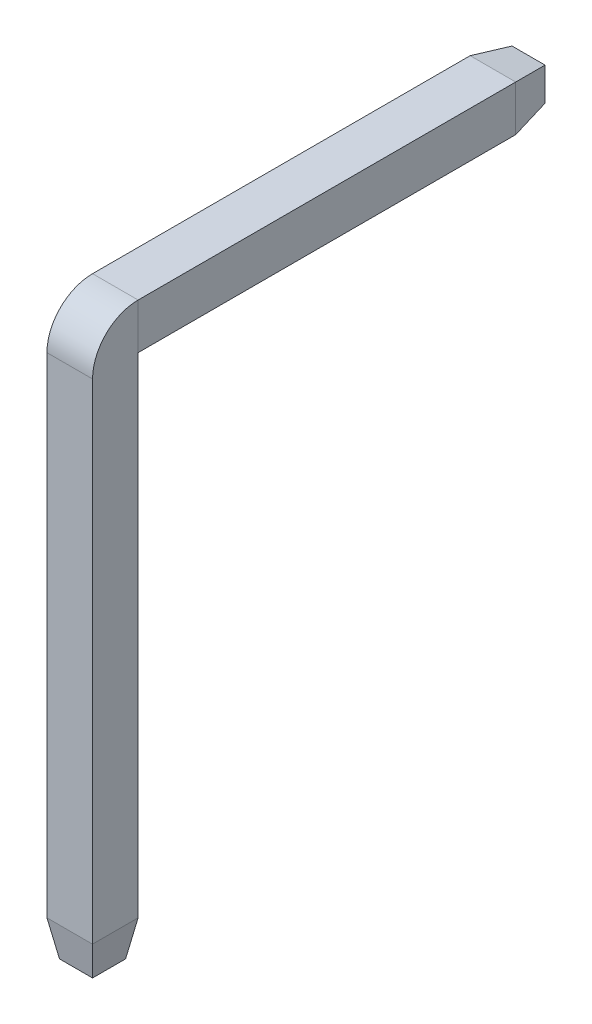
ISO-10303-21;
HEADER;
FILE_DESCRIPTION(('STEP AP214'),'2;1');
FILE_NAME('part.step','',(''),(''),'','','');
FILE_SCHEMA(('AUTOMOTIVE_DESIGN { 1 0 10303 214 1 1 1 1 }'));
ENDSEC;
DATA;
#1=APPLICATION_CONTEXT('core data for automotive mechanical design processes');
#2=APPLICATION_PROTOCOL_DEFINITION('international standard','automotive_design',2000,#1);
#3=PRODUCT_CONTEXT('',#1,'mechanical');
#4=PRODUCT('Part','Part','',(#3));
#5=PRODUCT_RELATED_PRODUCT_CATEGORY('part','',(#4));
#6=PRODUCT_DEFINITION_FORMATION('','',#4);
#7=PRODUCT_DEFINITION_CONTEXT('part definition',#1,'design');
#8=PRODUCT_DEFINITION('design','',#6,#7);
#9=PRODUCT_DEFINITION_SHAPE('','',#8);
#10=(LENGTH_UNIT() NAMED_UNIT(*) SI_UNIT(.MILLI.,.METRE.));
#11=(NAMED_UNIT(*) PLANE_ANGLE_UNIT() SI_UNIT($,.RADIAN.));
#12=(NAMED_UNIT(*) SI_UNIT($,.STERADIAN.) SOLID_ANGLE_UNIT());
#13=UNCERTAINTY_MEASURE_WITH_UNIT(LENGTH_MEASURE(1.E-05),#10,'distance_accuracy_value','');
#14=(GEOMETRIC_REPRESENTATION_CONTEXT(3) GLOBAL_UNCERTAINTY_ASSIGNED_CONTEXT((#13)) GLOBAL_UNIT_ASSIGNED_CONTEXT((#10,
#11,#12)) REPRESENTATION_CONTEXT('',''));
#15=CARTESIAN_POINT('',(0.,0.,0.));
#16=DIRECTION('',(0.,0.,1.));
#17=DIRECTION('',(1.,0.,0.));
#18=AXIS2_PLACEMENT_3D('',#15,#16,#17);
#19=CARTESIAN_POINT('',(-0.321,-2.50099999999999,0.320000000000001));
#20=DIRECTION('',(0.,0.,1.));
#21=DIRECTION('',(1.,0.,0.));
#22=AXIS2_PLACEMENT_3D('',#19,#20,#21);
#23=PLANE('',#22);
#24=DIRECTION('',(0.,-1.,0.));
#25=VECTOR('',#24,1.);
#26=CARTESIAN_POINT('',(0.32,1.255,0.320000000000001));
#27=LINE('',#26,#25);
#28=CARTESIAN_POINT('',(0.32,4.37,0.320000000000001));
#29=VERTEX_POINT('',#28);
#30=CARTESIAN_POINT('',(0.320000000000001,-2.49999999999999,0.320000000000001));
#31=VERTEX_POINT('',#30);
#32=EDGE_CURVE('P0_E103',#29,#31,#27,.T.);
#33=ORIENTED_EDGE('',*,*,#32,.F.);
#34=DIRECTION('',(-1.,0.,0.));
#35=VECTOR('',#34,1.);
#36=CARTESIAN_POINT('',(0.,4.37,0.320000000000001));
#37=LINE('',#36,#35);
#38=CARTESIAN_POINT('',(-0.32,4.37,0.320000000000001));
#39=VERTEX_POINT('',#38);
#40=EDGE_CURVE('P0_E71',#29,#39,#37,.T.);
#41=ORIENTED_EDGE('',*,*,#40,.T.);
#42=DIRECTION('',(0.,1.,0.));
#43=VECTOR('',#42,1.);
#44=CARTESIAN_POINT('',(-0.32,1.255,0.320000000000001));
#45=LINE('',#44,#43);
#46=CARTESIAN_POINT('',(-0.320000000000001,-2.49999999999998,0.320000000000002));
#47=VERTEX_POINT('',#46);
#48=EDGE_CURVE('P0_E83',#47,#39,#45,.T.);
#49=ORIENTED_EDGE('',*,*,#48,.F.);
#50=DIRECTION('',(-1.,0.,0.));
#51=VECTOR('',#50,1.);
#52=CARTESIAN_POINT('',(0.,-2.49999999999999,0.320000000000002));
#53=LINE('',#52,#51);
#54=EDGE_CURVE('P0_E61',#31,#47,#53,.T.);
#55=ORIENTED_EDGE('',*,*,#54,.F.);
#56=EDGE_LOOP('',(#33,#41,#49,#55));
#57=FACE_BOUND('',#56,.T.);
#58=ADVANCED_FACE('P0_F17',(#57),#23,.T.);
#59=CARTESIAN_POINT('',(0.321,-2.49901519224698,0.320173648177668));
#60=DIRECTION('',(0.,-0.17364817766693,0.984807753012208));
#61=DIRECTION('',(-1.,0.,0.));
#62=AXIS2_PLACEMENT_3D('',#59,#60,#61);
#63=PLANE('',#62);
#64=DIRECTION('',(-0.171087869746035,-0.970287525247814,-0.171087869746033));
#65=VECTOR('',#64,1.);
#66=CARTESIAN_POINT('',(0.320000000000001,-2.49999999999999,0.320000000000001));
#67=LINE('',#66,#65);
#68=CARTESIAN_POINT('',(0.231836509645767,-3.,0.231836509645768));
#69=VERTEX_POINT('',#68);
#70=EDGE_CURVE('P0_E21',#31,#69,#67,.T.);
#71=ORIENTED_EDGE('',*,*,#70,.F.);
#72=ORIENTED_EDGE('',*,*,#54,.T.);
#73=DIRECTION('',(-0.171087869746035,0.970287525247814,0.171087869746033));
#74=VECTOR('',#73,1.);
#75=CARTESIAN_POINT('',(-0.231836509645767,-3.,0.231836509645768));
#76=LINE('',#75,#74);
#77=CARTESIAN_POINT('',(-0.231836509645767,-3.,0.231836509645768));
#78=VERTEX_POINT('',#77);
#79=EDGE_CURVE('P0_E101',#78,#47,#76,.T.);
#80=ORIENTED_EDGE('',*,*,#79,.F.);
#81=DIRECTION('',(-1.,0.,0.));
#82=VECTOR('',#81,1.);
#83=CARTESIAN_POINT('',(0.,-3.,0.231836509645768));
#84=LINE('',#83,#82);
#85=EDGE_CURVE('P0_E111',#69,#78,#84,.T.);
#86=ORIENTED_EDGE('',*,*,#85,.F.);
#87=EDGE_LOOP('',(#71,#72,#80,#86));
#88=FACE_BOUND('',#87,.T.);
#89=ADVANCED_FACE('P0_F131',(#88),#63,.T.);
#90=CARTESIAN_POINT('',(0.32,-2.50099999999999,0.321000000000001));
#91=DIRECTION('',(1.,0.,0.));
#92=DIRECTION('',(0.,0.,-1.));
#93=AXIS2_PLACEMENT_3D('',#90,#91,#92);
#94=PLANE('',#93);
#95=ORIENTED_EDGE('',*,*,#32,.T.);
#96=DIRECTION('',(0.,0.,1.));
#97=VECTOR('',#96,1.);
#98=CARTESIAN_POINT('',(0.320000000000001,-2.49999999999999,0.));
#99=LINE('',#98,#97);
#100=CARTESIAN_POINT('',(0.32,-2.49999999999999,-0.320000000000001));
#101=VERTEX_POINT('',#100);
#102=EDGE_CURVE('P0_E106',#101,#31,#99,.T.);
#103=ORIENTED_EDGE('',*,*,#102,.F.);
#104=DIRECTION('',(0.,-1.,0.));
#105=VECTOR('',#104,1.);
#106=CARTESIAN_POINT('',(0.32,1.255,-0.32));
#107=LINE('',#106,#105);
#108=CARTESIAN_POINT('',(0.32,5.01,-0.32));
#109=VERTEX_POINT('',#108);
#110=EDGE_CURVE('P0_E78',#109,#101,#107,.T.);
#111=ORIENTED_EDGE('',*,*,#110,.F.);
#112=CARTESIAN_POINT('',(0.32,4.37,-0.32));
#113=DIRECTION('',(1.,0.,0.));
#114=DIRECTION('',(0.,0.,-1.));
#115=AXIS2_PLACEMENT_3D('',#112,#113,#114);
#116=CIRCLE('',#115,0.64);
#117=EDGE_CURVE('P0_E84',#29,#109,#116,.F.);
#118=ORIENTED_EDGE('',*,*,#117,.F.);
#119=EDGE_LOOP('',(#95,#103,#111,#118));
#120=FACE_BOUND('',#119,.T.);
#121=ADVANCED_FACE('P0_F138',(#120),#94,.T.);
#122=CARTESIAN_POINT('',(-0.32,-2.50099999999999,-0.321000000000001));
#123=DIRECTION('',(-1.,0.,0.));
#124=DIRECTION('',(0.,0.,1.));
#125=AXIS2_PLACEMENT_3D('',#122,#123,#124);
#126=PLANE('',#125);
#127=DIRECTION('',(0.,0.,-1.));
#128=VECTOR('',#127,1.);
#129=CARTESIAN_POINT('',(-0.320000000000001,-2.49999999999999,0.));
#130=LINE('',#129,#128);
#131=CARTESIAN_POINT('',(-0.320000000000001,-2.49999999999998,-0.320000000000001));
#132=VERTEX_POINT('',#131);
#133=EDGE_CURVE('P0_E100',#47,#132,#130,.T.);
#134=ORIENTED_EDGE('',*,*,#133,.F.);
#135=ORIENTED_EDGE('',*,*,#48,.T.);
#136=CARTESIAN_POINT('',(-0.32,4.37,-0.32));
#137=DIRECTION('',(-1.,0.,0.));
#138=DIRECTION('',(0.,0.,1.));
#139=AXIS2_PLACEMENT_3D('',#136,#137,#138);
#140=CIRCLE('',#139,0.64);
#141=CARTESIAN_POINT('',(-0.32,5.01,-0.32));
#142=VERTEX_POINT('',#141);
#143=EDGE_CURVE('P0_E80',#142,#39,#140,.F.);
#144=ORIENTED_EDGE('',*,*,#143,.F.);
#145=DIRECTION('',(0.,1.,0.));
#146=VECTOR('',#145,1.);
#147=CARTESIAN_POINT('',(-0.32,1.255,-0.32));
#148=LINE('',#147,#146);
#149=EDGE_CURVE('P0_E36',#132,#142,#148,.T.);
#150=ORIENTED_EDGE('',*,*,#149,.F.);
#151=EDGE_LOOP('',(#134,#135,#144,#150));
#152=FACE_BOUND('',#151,.T.);
#153=ADVANCED_FACE('P0_F82',(#152),#126,.T.);
#154=CARTESIAN_POINT('',(-0.32,4.37,-0.32));
#155=DIRECTION('',(1.,0.,0.));
#156=DIRECTION('',(0.,0.,-1.));
#157=AXIS2_PLACEMENT_3D('',#154,#155,#156);
#158=CYLINDRICAL_SURFACE('',#157,0.64);
#159=DIRECTION('',(1.,0.,0.));
#160=VECTOR('',#159,1.);
#161=CARTESIAN_POINT('',(0.,5.01,-0.32));
#162=LINE('',#161,#160);
#163=EDGE_CURVE('P0_E87',#142,#109,#162,.T.);
#164=ORIENTED_EDGE('',*,*,#163,.F.);
#165=ORIENTED_EDGE('',*,*,#143,.T.);
#166=ORIENTED_EDGE('',*,*,#40,.F.);
#167=ORIENTED_EDGE('',*,*,#117,.T.);
#168=EDGE_LOOP('',(#164,#165,#166,#167));
#169=FACE_BOUND('',#168,.T.);
#170=ADVANCED_FACE('P0_F88',(#169),#158,.T.);
#171=CARTESIAN_POINT('',(0.320173648177667,-2.49901519224698,-0.321000000000001));
#172=DIRECTION('',(0.984807753012208,-0.17364817766693,0.));
#173=DIRECTION('',(0.,0.,1.));
#174=AXIS2_PLACEMENT_3D('',#171,#172,#173);
#175=PLANE('',#174);
#176=DIRECTION('',(-0.171087869746033,-0.970287525247815,0.171087869746035));
#177=VECTOR('',#176,1.);
#178=CARTESIAN_POINT('',(0.32,-2.49999999999999,-0.320000000000002));
#179=LINE('',#178,#177);
#180=CARTESIAN_POINT('',(0.231836509645767,-3.,-0.231836509645768));
#181=VERTEX_POINT('',#180);
#182=EDGE_CURVE('P0_E90',#101,#181,#179,.T.);
#183=ORIENTED_EDGE('',*,*,#182,.F.);
#184=ORIENTED_EDGE('',*,*,#102,.T.);
#185=ORIENTED_EDGE('',*,*,#70,.T.);
#186=DIRECTION('',(0.,0.,1.));
#187=VECTOR('',#186,1.);
#188=CARTESIAN_POINT('',(0.231836509645767,-3.,0.));
#189=LINE('',#188,#187);
#190=EDGE_CURVE('P0_E109',#181,#69,#189,.T.);
#191=ORIENTED_EDGE('',*,*,#190,.F.);
#192=EDGE_LOOP('',(#183,#184,#185,#191));
#193=FACE_BOUND('',#192,.T.);
#194=ADVANCED_FACE('P0_F137',(#193),#175,.T.);
#195=CARTESIAN_POINT('',(-0.232836509645767,-3.,0.232836509645768));
#196=DIRECTION('',(0.,-1.,0.));
#197=DIRECTION('',(0.,0.,-1.));
#198=AXIS2_PLACEMENT_3D('',#195,#196,#197);
#199=PLANE('',#198);
#200=ORIENTED_EDGE('',*,*,#190,.T.);
#201=ORIENTED_EDGE('',*,*,#85,.T.);
#202=DIRECTION('',(0.,0.,1.));
#203=VECTOR('',#202,1.);
#204=CARTESIAN_POINT('',(-0.231836509645767,-3.,0.));
#205=LINE('',#204,#203);
#206=CARTESIAN_POINT('',(-0.231836509645767,-3.,-0.231836509645768));
#207=VERTEX_POINT('',#206);
#208=EDGE_CURVE('P0_E96',#207,#78,#205,.T.);
#209=ORIENTED_EDGE('',*,*,#208,.F.);
#210=DIRECTION('',(-1.,0.,0.));
#211=VECTOR('',#210,1.);
#212=CARTESIAN_POINT('',(0.,-3.,-0.231836509645768));
#213=LINE('',#212,#211);
#214=EDGE_CURVE('P0_E118',#181,#207,#213,.T.);
#215=ORIENTED_EDGE('',*,*,#214,.F.);
#216=EDGE_LOOP('',(#200,#201,#209,#215));
#217=FACE_BOUND('',#216,.T.);
#218=ADVANCED_FACE('P0_F133',(#217),#199,.T.);
#219=CARTESIAN_POINT('',(-0.320173648177667,-2.49901519224698,0.321000000000001));
#220=DIRECTION('',(-0.984807753012208,-0.17364817766693,0.));
#221=DIRECTION('',(0.,0.,-1.));
#222=AXIS2_PLACEMENT_3D('',#219,#220,#221);
#223=PLANE('',#222);
#224=DIRECTION('',(-0.171087869746033,0.970287525247814,-0.171087869746035));
#225=VECTOR('',#224,1.);
#226=CARTESIAN_POINT('',(-0.231836509645767,-3.,-0.231836509645768));
#227=LINE('',#226,#225);
#228=EDGE_CURVE('P0_E27',#207,#132,#227,.T.);
#229=ORIENTED_EDGE('',*,*,#228,.F.);
#230=ORIENTED_EDGE('',*,*,#208,.T.);
#231=ORIENTED_EDGE('',*,*,#79,.T.);
#232=ORIENTED_EDGE('',*,*,#133,.T.);
#233=EDGE_LOOP('',(#229,#230,#231,#232));
#234=FACE_BOUND('',#233,.T.);
#235=ADVANCED_FACE('P0_F128',(#234),#223,.T.);
#236=CARTESIAN_POINT('',(-0.321,-2.50099999999999,-0.32));
#237=DIRECTION('',(0.,0.,-1.));
#238=DIRECTION('',(0.,1.,0.));
#239=AXIS2_PLACEMENT_3D('',#236,#237,#238);
#240=PLANE('',#239);
#241=ORIENTED_EDGE('',*,*,#149,.T.);
#242=ORIENTED_EDGE('',*,*,#163,.T.);
#243=ORIENTED_EDGE('',*,*,#110,.T.);
#244=DIRECTION('',(1.,0.,0.));
#245=VECTOR('',#244,1.);
#246=CARTESIAN_POINT('',(0.,-2.49999999999999,-0.320000000000002));
#247=LINE('',#246,#245);
#248=EDGE_CURVE('P0_E11',#132,#101,#247,.T.);
#249=ORIENTED_EDGE('',*,*,#248,.F.);
#250=EDGE_LOOP('',(#241,#242,#243,#249));
#251=FACE_BOUND('',#250,.T.);
#252=ADVANCED_FACE('P0_F93',(#251),#240,.T.);
#253=CARTESIAN_POINT('',(-0.321,-2.49901519224698,-0.320173648177668));
#254=DIRECTION('',(0.,-0.17364817766693,-0.984807753012208));
#255=DIRECTION('',(1.,0.,0.));
#256=AXIS2_PLACEMENT_3D('',#253,#254,#255);
#257=PLANE('',#256);
#258=ORIENTED_EDGE('',*,*,#228,.T.);
#259=ORIENTED_EDGE('',*,*,#248,.T.);
#260=ORIENTED_EDGE('',*,*,#182,.T.);
#261=ORIENTED_EDGE('',*,*,#214,.T.);
#262=EDGE_LOOP('',(#258,#259,#260,#261));
#263=FACE_BOUND('',#262,.T.);
#264=ADVANCED_FACE('P0_F19',(#263),#257,.T.);
#265=CLOSED_SHELL('',(#58,#89,#121,#153,#170,#194,#218,#235,#252,#264));
#266=MANIFOLD_SOLID_BREP('P0_B1',#265);
#267=CARTESIAN_POINT('',(0.321,4.9216628614681,-6.12098480775301));
#268=DIRECTION('',(0.,0.984807753012207,-0.173648177666934));
#269=DIRECTION('',(-1.,0.,0.));
#270=AXIS2_PLACEMENT_3D('',#267,#268,#269);
#271=PLANE('',#270);
#272=DIRECTION('',(0.171087869746036,0.171087869746027,0.970287525247815));
#273=VECTOR('',#272,1.);
#274=CARTESIAN_POINT('',(0.231836509645766,4.92183650964577,-6.12));
#275=LINE('',#274,#273);
#276=CARTESIAN_POINT('',(0.231836509645766,4.92183650964577,-6.12));
#277=VERTEX_POINT('',#276);
#278=CARTESIAN_POINT('',(0.32,5.01,-5.61999999999999));
#279=VERTEX_POINT('',#278);
#280=EDGE_CURVE('P1_E106',#277,#279,#275,.T.);
#281=ORIENTED_EDGE('',*,*,#280,.F.);
#282=DIRECTION('',(1.,0.,0.));
#283=VECTOR('',#282,1.);
#284=CARTESIAN_POINT('',(0.,4.92183650964577,-6.12));
#285=LINE('',#284,#283);
#286=CARTESIAN_POINT('',(-0.231836509645767,4.92183650964577,-6.12));
#287=VERTEX_POINT('',#286);
#288=EDGE_CURVE('P1_E71',#287,#277,#285,.T.);
#289=ORIENTED_EDGE('',*,*,#288,.F.);
#290=DIRECTION('',(0.171087869746036,-0.171087869746029,-0.970287525247815));
#291=VECTOR('',#290,1.);
#292=CARTESIAN_POINT('',(-0.320000000000001,5.01,-5.61999999999999));
#293=LINE('',#292,#291);
#294=CARTESIAN_POINT('',(-0.320000000000001,5.01,-5.61999999999999));
#295=VERTEX_POINT('',#294);
#296=EDGE_CURVE('P1_E21',#295,#287,#293,.T.);
#297=ORIENTED_EDGE('',*,*,#296,.F.);
#298=DIRECTION('',(-1.,0.,0.));
#299=VECTOR('',#298,1.);
#300=CARTESIAN_POINT('',(0.,5.01,-5.61999999999999));
#301=LINE('',#300,#299);
#302=EDGE_CURVE('P1_E69',#279,#295,#301,.T.);
#303=ORIENTED_EDGE('',*,*,#302,.F.);
#304=EDGE_LOOP('',(#281,#289,#297,#303));
#305=FACE_BOUND('',#304,.T.);
#306=ADVANCED_FACE('P1_F17',(#305),#271,.T.);
#307=CARTESIAN_POINT('',(-0.2316628614681,5.011,-6.12098480775301));
#308=DIRECTION('',(-0.984807753012208,0.,-0.17364817766693));
#309=DIRECTION('',(0.,-1.,0.));
#310=AXIS2_PLACEMENT_3D('',#307,#308,#309);
#311=PLANE('',#310);
#312=ORIENTED_EDGE('',*,*,#296,.T.);
#313=DIRECTION('',(0.,1.,0.));
#314=VECTOR('',#313,1.);
#315=CARTESIAN_POINT('',(-0.231836509645767,4.69,-6.12));
#316=LINE('',#315,#314);
#317=CARTESIAN_POINT('',(-0.231836509645767,4.45816349035423,-6.12));
#318=VERTEX_POINT('',#317);
#319=EDGE_CURVE('P1_E75',#318,#287,#316,.T.);
#320=ORIENTED_EDGE('',*,*,#319,.F.);
#321=DIRECTION('',(0.171087869746033,0.17108786974604,-0.970287525247813));
#322=VECTOR('',#321,1.);
#323=CARTESIAN_POINT('',(-0.32,4.37,-5.61999999999999));
#324=LINE('',#323,#322);
#325=CARTESIAN_POINT('',(-0.32,4.37,-5.61999999999999));
#326=VERTEX_POINT('',#325);
#327=EDGE_CURVE('P1_E92',#326,#318,#324,.T.);
#328=ORIENTED_EDGE('',*,*,#327,.F.);
#329=DIRECTION('',(0.,-1.,0.));
#330=VECTOR('',#329,1.);
#331=CARTESIAN_POINT('',(-0.32,4.69,-5.61999999999999));
#332=LINE('',#331,#330);
#333=EDGE_CURVE('P1_E89',#295,#326,#332,.T.);
#334=ORIENTED_EDGE('',*,*,#333,.F.);
#335=EDGE_LOOP('',(#312,#320,#328,#334));
#336=FACE_BOUND('',#335,.T.);
#337=ADVANCED_FACE('P1_F90',(#336),#311,.T.);
#338=CARTESIAN_POINT('',(-0.232836509645767,4.45716349035423,-6.12));
#339=DIRECTION('',(0.,0.,-1.));
#340=DIRECTION('',(0.,1.,0.));
#341=AXIS2_PLACEMENT_3D('',#338,#339,#340);
#342=PLANE('',#341);
#343=DIRECTION('',(0.,1.,0.));
#344=VECTOR('',#343,1.);
#345=CARTESIAN_POINT('',(0.231836509645766,4.69,-6.12));
#346=LINE('',#345,#344);
#347=CARTESIAN_POINT('',(0.231836509645767,4.45816349035423,-6.12));
#348=VERTEX_POINT('',#347);
#349=EDGE_CURVE('P1_E102',#348,#277,#346,.T.);
#350=ORIENTED_EDGE('',*,*,#349,.F.);
#351=DIRECTION('',(1.,0.,0.));
#352=VECTOR('',#351,1.);
#353=CARTESIAN_POINT('',(0.,4.45816349035423,-6.12));
#354=LINE('',#353,#352);
#355=EDGE_CURVE('P1_E117',#318,#348,#354,.T.);
#356=ORIENTED_EDGE('',*,*,#355,.F.);
#357=ORIENTED_EDGE('',*,*,#319,.T.);
#358=ORIENTED_EDGE('',*,*,#288,.T.);
#359=EDGE_LOOP('',(#350,#356,#357,#358));
#360=FACE_BOUND('',#359,.T.);
#361=ADVANCED_FACE('P1_F154',(#360),#342,.T.);
#362=CARTESIAN_POINT('',(0.2316628614681,4.369,-6.12098480775301));
#363=DIRECTION('',(0.984807753012208,0.,-0.17364817766693));
#364=DIRECTION('',(0.,1.,0.));
#365=AXIS2_PLACEMENT_3D('',#362,#363,#364);
#366=PLANE('',#365);
#367=ORIENTED_EDGE('',*,*,#280,.T.);
#368=DIRECTION('',(0.,1.,0.));
#369=VECTOR('',#368,1.);
#370=CARTESIAN_POINT('',(0.32,4.69,-5.61999999999999));
#371=LINE('',#370,#369);
#372=CARTESIAN_POINT('',(0.32,4.37,-5.62));
#373=VERTEX_POINT('',#372);
#374=EDGE_CURVE('P1_E109',#373,#279,#371,.T.);
#375=ORIENTED_EDGE('',*,*,#374,.F.);
#376=DIRECTION('',(0.171087869746034,-0.171087869746041,0.970287525247813));
#377=VECTOR('',#376,1.);
#378=CARTESIAN_POINT('',(0.231836509645767,4.45816349035423,-6.12));
#379=LINE('',#378,#377);
#380=EDGE_CURVE('P1_E95',#348,#373,#379,.T.);
#381=ORIENTED_EDGE('',*,*,#380,.F.);
#382=ORIENTED_EDGE('',*,*,#349,.T.);
#383=EDGE_LOOP('',(#367,#375,#381,#382));
#384=FACE_BOUND('',#383,.T.);
#385=ADVANCED_FACE('P1_F151',(#384),#366,.T.);
#386=CARTESIAN_POINT('',(-0.321,5.01,-0.318999999999999));
#387=DIRECTION('',(0.,1.,0.));
#388=DIRECTION('',(1.,0.,0.));
#389=AXIS2_PLACEMENT_3D('',#386,#387,#388);
#390=PLANE('',#389);
#391=ORIENTED_EDGE('',*,*,#302,.T.);
#392=DIRECTION('',(0.,0.,-1.));
#393=VECTOR('',#392,1.);
#394=CARTESIAN_POINT('',(-0.32,5.01,-2.96999999999999));
#395=LINE('',#394,#393);
#396=CARTESIAN_POINT('',(-0.32,5.01,-0.32));
#397=VERTEX_POINT('',#396);
#398=EDGE_CURVE('P1_E82',#397,#295,#395,.T.);
#399=ORIENTED_EDGE('',*,*,#398,.F.);
#400=DIRECTION('',(1.,0.,0.));
#401=VECTOR('',#400,1.);
#402=CARTESIAN_POINT('',(0.,5.01,-0.32));
#403=LINE('',#402,#401);
#404=CARTESIAN_POINT('',(0.32,5.01,-0.32));
#405=VERTEX_POINT('',#404);
#406=EDGE_CURVE('P1_E86',#397,#405,#403,.T.);
#407=ORIENTED_EDGE('',*,*,#406,.T.);
#408=DIRECTION('',(0.,0.,1.));
#409=VECTOR('',#408,1.);
#410=CARTESIAN_POINT('',(0.32,5.01,-2.96999999999999));
#411=LINE('',#410,#409);
#412=EDGE_CURVE('P1_E84',#279,#405,#411,.T.);
#413=ORIENTED_EDGE('',*,*,#412,.F.);
#414=EDGE_LOOP('',(#391,#399,#407,#413));
#415=FACE_BOUND('',#414,.T.);
#416=ADVANCED_FACE('P1_F79',(#415),#390,.T.);
#417=CARTESIAN_POINT('',(-0.32,4.369,-0.318999999999999));
#418=DIRECTION('',(-1.,0.,0.));
#419=DIRECTION('',(0.,1.,0.));
#420=AXIS2_PLACEMENT_3D('',#417,#418,#419);
#421=PLANE('',#420);
#422=ORIENTED_EDGE('',*,*,#333,.T.);
#423=DIRECTION('',(0.,0.,-1.));
#424=VECTOR('',#423,1.);
#425=CARTESIAN_POINT('',(-0.32,4.37,-2.96999999999999));
#426=LINE('',#425,#424);
#427=CARTESIAN_POINT('',(-0.32,4.37,-0.32));
#428=VERTEX_POINT('',#427);
#429=EDGE_CURVE('P1_E108',#428,#326,#426,.T.);
#430=ORIENTED_EDGE('',*,*,#429,.F.);
#431=DIRECTION('',(0.,1.,0.));
#432=VECTOR('',#431,1.);
#433=CARTESIAN_POINT('',(-0.32,4.69,-0.32));
#434=LINE('',#433,#432);
#435=EDGE_CURVE('P1_E35',#428,#397,#434,.T.);
#436=ORIENTED_EDGE('',*,*,#435,.T.);
#437=ORIENTED_EDGE('',*,*,#398,.T.);
#438=EDGE_LOOP('',(#422,#430,#436,#437));
#439=FACE_BOUND('',#438,.T.);
#440=ADVANCED_FACE('P1_F97',(#439),#421,.T.);
#441=CARTESIAN_POINT('',(-0.321,4.4583371385319,-6.12098480775301));
#442=DIRECTION('',(0.,-0.984807753012207,-0.173648177666936));
#443=DIRECTION('',(1.,0.,0.));
#444=AXIS2_PLACEMENT_3D('',#441,#442,#443);
#445=PLANE('',#444);
#446=ORIENTED_EDGE('',*,*,#327,.T.);
#447=ORIENTED_EDGE('',*,*,#355,.T.);
#448=ORIENTED_EDGE('',*,*,#380,.T.);
#449=DIRECTION('',(1.,0.,0.));
#450=VECTOR('',#449,1.);
#451=CARTESIAN_POINT('',(0.,4.37,-5.61999999999999));
#452=LINE('',#451,#450);
#453=EDGE_CURVE('P1_E112',#326,#373,#452,.T.);
#454=ORIENTED_EDGE('',*,*,#453,.F.);
#455=EDGE_LOOP('',(#446,#447,#448,#454));
#456=FACE_BOUND('',#455,.T.);
#457=ADVANCED_FACE('P1_F141',(#456),#445,.T.);
#458=CARTESIAN_POINT('',(0.32,5.011,-0.318999999999999));
#459=DIRECTION('',(1.,0.,0.));
#460=DIRECTION('',(0.,-1.,0.));
#461=AXIS2_PLACEMENT_3D('',#458,#459,#460);
#462=PLANE('',#461);
#463=ORIENTED_EDGE('',*,*,#374,.T.);
#464=ORIENTED_EDGE('',*,*,#412,.T.);
#465=DIRECTION('',(0.,-1.,0.));
#466=VECTOR('',#465,1.);
#467=CARTESIAN_POINT('',(0.32,4.69,-0.32));
#468=LINE('',#467,#466);
#469=CARTESIAN_POINT('',(0.32,4.37,-0.32));
#470=VERTEX_POINT('',#469);
#471=EDGE_CURVE('P1_E111',#405,#470,#468,.T.);
#472=ORIENTED_EDGE('',*,*,#471,.T.);
#473=DIRECTION('',(0.,0.,1.));
#474=VECTOR('',#473,1.);
#475=CARTESIAN_POINT('',(0.32,4.37,-2.96999999999999));
#476=LINE('',#475,#474);
#477=EDGE_CURVE('P1_E27',#373,#470,#476,.T.);
#478=ORIENTED_EDGE('',*,*,#477,.F.);
#479=EDGE_LOOP('',(#463,#464,#472,#478));
#480=FACE_BOUND('',#479,.T.);
#481=ADVANCED_FACE('P1_F129',(#480),#462,.T.);
#482=CARTESIAN_POINT('',(0.321,4.37,-0.318999999999999));
#483=DIRECTION('',(0.,-1.,0.));
#484=DIRECTION('',(-1.,0.,0.));
#485=AXIS2_PLACEMENT_3D('',#482,#483,#484);
#486=PLANE('',#485);
#487=ORIENTED_EDGE('',*,*,#453,.T.);
#488=ORIENTED_EDGE('',*,*,#477,.T.);
#489=DIRECTION('',(1.,0.,0.));
#490=VECTOR('',#489,1.);
#491=CARTESIAN_POINT('',(0.,4.37,-0.32));
#492=LINE('',#491,#490);
#493=EDGE_CURVE('P1_E11',#428,#470,#492,.T.);
#494=ORIENTED_EDGE('',*,*,#493,.F.);
#495=ORIENTED_EDGE('',*,*,#429,.T.);
#496=EDGE_LOOP('',(#487,#488,#494,#495));
#497=FACE_BOUND('',#496,.T.);
#498=ADVANCED_FACE('P1_F132',(#497),#486,.T.);
#499=CARTESIAN_POINT('',(-0.321,5.011,-0.32));
#500=DIRECTION('',(0.,0.,1.));
#501=DIRECTION('',(0.,-1.,0.));
#502=AXIS2_PLACEMENT_3D('',#499,#500,#501);
#503=PLANE('',#502);
#504=ORIENTED_EDGE('',*,*,#435,.F.);
#505=ORIENTED_EDGE('',*,*,#493,.T.);
#506=ORIENTED_EDGE('',*,*,#471,.F.);
#507=ORIENTED_EDGE('',*,*,#406,.F.);
#508=EDGE_LOOP('',(#504,#505,#506,#507));
#509=FACE_BOUND('',#508,.T.);
#510=ADVANCED_FACE('P1_F19',(#509),#503,.T.);
#511=CLOSED_SHELL('',(#306,#337,#361,#385,#416,#440,#457,#481,#498,#510));
#512=MANIFOLD_SOLID_BREP('P1_B1',#511);
#513=ADVANCED_BREP_SHAPE_REPRESENTATION('',(#18,#266,#512),#14);
#514=SHAPE_DEFINITION_REPRESENTATION(#9,#513);
ENDSEC;
END-ISO-10303-21;
